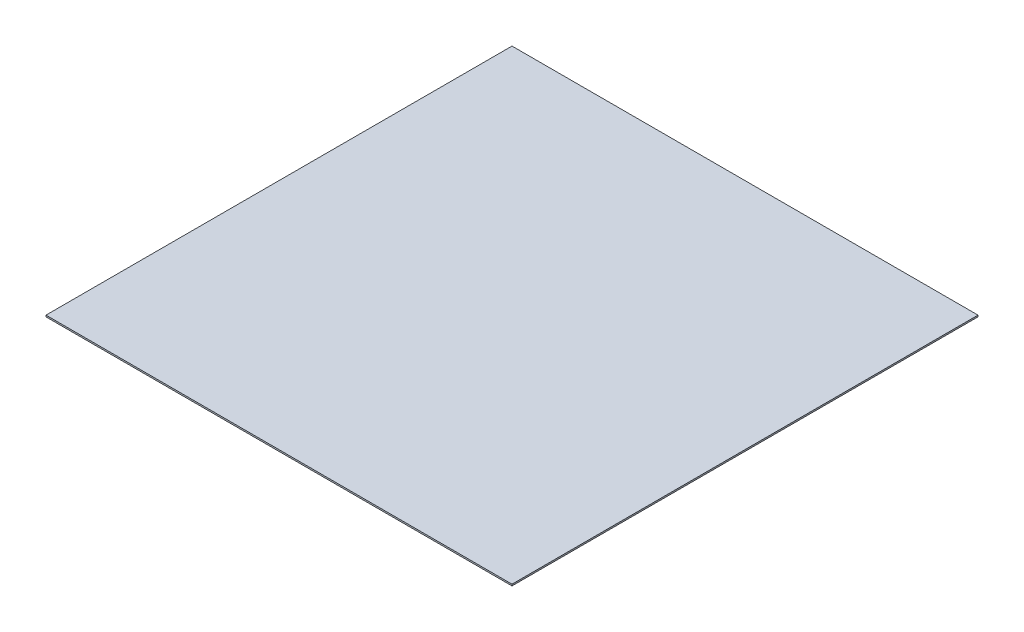
ISO-10303-21;
HEADER;
FILE_DESCRIPTION(('STEP AP214'),'2;1');
FILE_NAME('part.step','',(''),(''),'','','');
FILE_SCHEMA(('AUTOMOTIVE_DESIGN { 1 0 10303 214 1 1 1 1 }'));
ENDSEC;
DATA;
#1=APPLICATION_CONTEXT('core data for automotive mechanical design processes');
#2=APPLICATION_PROTOCOL_DEFINITION('international standard','automotive_design',2000,#1);
#3=PRODUCT_CONTEXT('',#1,'mechanical');
#4=PRODUCT('Part','Part','',(#3));
#5=PRODUCT_RELATED_PRODUCT_CATEGORY('part','',(#4));
#6=PRODUCT_DEFINITION_FORMATION('','',#4);
#7=PRODUCT_DEFINITION_CONTEXT('part definition',#1,'design');
#8=PRODUCT_DEFINITION('design','',#6,#7);
#9=PRODUCT_DEFINITION_SHAPE('','',#8);
#10=(LENGTH_UNIT() NAMED_UNIT(*) SI_UNIT(.MILLI.,.METRE.));
#11=(NAMED_UNIT(*) PLANE_ANGLE_UNIT() SI_UNIT($,.RADIAN.));
#12=(NAMED_UNIT(*) SI_UNIT($,.STERADIAN.) SOLID_ANGLE_UNIT());
#13=UNCERTAINTY_MEASURE_WITH_UNIT(LENGTH_MEASURE(1.E-05),#10,'distance_accuracy_value','');
#14=(GEOMETRIC_REPRESENTATION_CONTEXT(3) GLOBAL_UNCERTAINTY_ASSIGNED_CONTEXT((#13)) GLOBAL_UNIT_ASSIGNED_CONTEXT((#10,
#11,#12)) REPRESENTATION_CONTEXT('',''));
#15=CARTESIAN_POINT('',(0.,0.,0.));
#16=DIRECTION('',(0.,0.,1.));
#17=DIRECTION('',(1.,0.,0.));
#18=AXIS2_PLACEMENT_3D('',#15,#16,#17);
#19=CARTESIAN_POINT('',(0.,10.,0.));
#20=DIRECTION('',(1.,0.,0.));
#21=DIRECTION('',(0.,0.,-1.));
#22=AXIS2_PLACEMENT_3D('',#19,#20,#21);
#23=PLANE('',#22);
#24=DIRECTION('',(0.,0.,1.));
#25=VECTOR('',#24,1.);
#26=CARTESIAN_POINT('',(0.,0.,0.));
#27=LINE('',#26,#25);
#28=CARTESIAN_POINT('',(0.,0.,-3000.));
#29=VERTEX_POINT('',#28);
#30=CARTESIAN_POINT('',(0.,0.,0.));
#31=VERTEX_POINT('',#30);
#32=EDGE_CURVE('E98',#29,#31,#27,.T.);
#33=ORIENTED_EDGE('',*,*,#32,.T.);
#34=DIRECTION('',(0.,-1.,0.));
#35=VECTOR('',#34,1.);
#36=CARTESIAN_POINT('',(0.,10.,0.));
#37=LINE('',#36,#35);
#38=CARTESIAN_POINT('',(0.,10.,0.));
#39=VERTEX_POINT('',#38);
#40=EDGE_CURVE('E11',#39,#31,#37,.T.);
#41=ORIENTED_EDGE('',*,*,#40,.F.);
#42=DIRECTION('',(0.,0.,1.));
#43=VECTOR('',#42,1.);
#44=CARTESIAN_POINT('',(0.,10.,0.));
#45=LINE('',#44,#43);
#46=CARTESIAN_POINT('',(0.,10.,-3000.));
#47=VERTEX_POINT('',#46);
#48=EDGE_CURVE('E86',#47,#39,#45,.T.);
#49=ORIENTED_EDGE('',*,*,#48,.F.);
#50=DIRECTION('',(0.,-1.,0.));
#51=VECTOR('',#50,1.);
#52=CARTESIAN_POINT('',(0.,10.,-3000.));
#53=LINE('',#52,#51);
#54=EDGE_CURVE('E94',#47,#29,#53,.T.);
#55=ORIENTED_EDGE('',*,*,#54,.T.);
#56=EDGE_LOOP('',(#33,#41,#49,#55));
#57=FACE_BOUND('',#56,.T.);
#58=ADVANCED_FACE('F35',(#57),#23,.F.);
#59=CARTESIAN_POINT('',(0.,10.,0.));
#60=DIRECTION('',(0.,0.,-1.));
#61=DIRECTION('',(-1.,0.,0.));
#62=AXIS2_PLACEMENT_3D('',#59,#60,#61);
#63=PLANE('',#62);
#64=DIRECTION('',(1.,0.,0.));
#65=VECTOR('',#64,1.);
#66=CARTESIAN_POINT('',(0.,0.,0.));
#67=LINE('',#66,#65);
#68=CARTESIAN_POINT('',(3000.,0.,0.));
#69=VERTEX_POINT('',#68);
#70=EDGE_CURVE('E90',#31,#69,#67,.T.);
#71=ORIENTED_EDGE('',*,*,#70,.T.);
#72=DIRECTION('',(0.,-1.,0.));
#73=VECTOR('',#72,1.);
#74=CARTESIAN_POINT('',(3000.,10.,0.));
#75=LINE('',#74,#73);
#76=CARTESIAN_POINT('',(3000.,10.,0.));
#77=VERTEX_POINT('',#76);
#78=EDGE_CURVE('E43',#77,#69,#75,.T.);
#79=ORIENTED_EDGE('',*,*,#78,.F.);
#80=DIRECTION('',(1.,0.,0.));
#81=VECTOR('',#80,1.);
#82=CARTESIAN_POINT('',(0.,10.,0.));
#83=LINE('',#82,#81);
#84=EDGE_CURVE('E81',#39,#77,#83,.T.);
#85=ORIENTED_EDGE('',*,*,#84,.F.);
#86=ORIENTED_EDGE('',*,*,#40,.T.);
#87=EDGE_LOOP('',(#71,#79,#85,#86));
#88=FACE_BOUND('',#87,.T.);
#89=ADVANCED_FACE('F89',(#88),#63,.F.);
#90=CARTESIAN_POINT('',(3000.,10.,0.));
#91=DIRECTION('',(-1.,0.,0.));
#92=DIRECTION('',(0.,0.,1.));
#93=AXIS2_PLACEMENT_3D('',#90,#91,#92);
#94=PLANE('',#93);
#95=DIRECTION('',(0.,0.,-1.));
#96=VECTOR('',#95,1.);
#97=CARTESIAN_POINT('',(3000.,0.,0.));
#98=LINE('',#97,#96);
#99=CARTESIAN_POINT('',(3000.,0.,-3000.));
#100=VERTEX_POINT('',#99);
#101=EDGE_CURVE('E68',#69,#100,#98,.T.);
#102=ORIENTED_EDGE('',*,*,#101,.T.);
#103=DIRECTION('',(0.,-1.,0.));
#104=VECTOR('',#103,1.);
#105=CARTESIAN_POINT('',(3000.,10.,-3000.));
#106=LINE('',#105,#104);
#107=CARTESIAN_POINT('',(3000.,10.,-3000.));
#108=VERTEX_POINT('',#107);
#109=EDGE_CURVE('E91',#108,#100,#106,.T.);
#110=ORIENTED_EDGE('',*,*,#109,.F.);
#111=DIRECTION('',(0.,0.,-1.));
#112=VECTOR('',#111,1.);
#113=CARTESIAN_POINT('',(3000.,10.,0.));
#114=LINE('',#113,#112);
#115=EDGE_CURVE('E84',#77,#108,#114,.T.);
#116=ORIENTED_EDGE('',*,*,#115,.F.);
#117=ORIENTED_EDGE('',*,*,#78,.T.);
#118=EDGE_LOOP('',(#102,#110,#116,#117));
#119=FACE_BOUND('',#118,.T.);
#120=ADVANCED_FACE('F92',(#119),#94,.F.);
#121=CARTESIAN_POINT('',(0.,10.,-3000.));
#122=DIRECTION('',(0.,0.,1.));
#123=DIRECTION('',(1.,0.,0.));
#124=AXIS2_PLACEMENT_3D('',#121,#122,#123);
#125=PLANE('',#124);
#126=DIRECTION('',(-1.,0.,0.));
#127=VECTOR('',#126,1.);
#128=CARTESIAN_POINT('',(0.,0.,-3000.));
#129=LINE('',#128,#127);
#130=EDGE_CURVE('E74',#100,#29,#129,.T.);
#131=ORIENTED_EDGE('',*,*,#130,.T.);
#132=ORIENTED_EDGE('',*,*,#54,.F.);
#133=DIRECTION('',(-1.,0.,0.));
#134=VECTOR('',#133,1.);
#135=CARTESIAN_POINT('',(0.,10.,-3000.));
#136=LINE('',#135,#134);
#137=EDGE_CURVE('E51',#108,#47,#136,.T.);
#138=ORIENTED_EDGE('',*,*,#137,.F.);
#139=ORIENTED_EDGE('',*,*,#109,.T.);
#140=EDGE_LOOP('',(#131,#132,#138,#139));
#141=FACE_BOUND('',#140,.T.);
#142=ADVANCED_FACE('F105',(#141),#125,.F.);
#143=CARTESIAN_POINT('',(0.,10.,0.));
#144=DIRECTION('',(0.,-1.,0.));
#145=DIRECTION('',(0.,0.,-1.));
#146=AXIS2_PLACEMENT_3D('',#143,#144,#145);
#147=PLANE('',#146);
#148=ORIENTED_EDGE('',*,*,#48,.T.);
#149=ORIENTED_EDGE('',*,*,#84,.T.);
#150=ORIENTED_EDGE('',*,*,#115,.T.);
#151=ORIENTED_EDGE('',*,*,#137,.T.);
#152=EDGE_LOOP('',(#148,#149,#150,#151));
#153=FACE_BOUND('',#152,.T.);
#154=ADVANCED_FACE('F82',(#153),#147,.F.);
#155=CARTESIAN_POINT('',(0.,0.,0.));
#156=DIRECTION('',(0.,-1.,0.));
#157=DIRECTION('',(0.,0.,-1.));
#158=AXIS2_PLACEMENT_3D('',#155,#156,#157);
#159=PLANE('',#158);
#160=ORIENTED_EDGE('',*,*,#32,.F.);
#161=ORIENTED_EDGE('',*,*,#130,.F.);
#162=ORIENTED_EDGE('',*,*,#101,.F.);
#163=ORIENTED_EDGE('',*,*,#70,.F.);
#164=EDGE_LOOP('',(#160,#161,#162,#163));
#165=FACE_BOUND('',#164,.T.);
#166=ADVANCED_FACE('F108',(#165),#159,.T.);
#167=CLOSED_SHELL('',(#58,#89,#120,#142,#154,#166));
#168=MANIFOLD_SOLID_BREP('B2',#167);
#169=ADVANCED_BREP_SHAPE_REPRESENTATION('',(#18,#168),#14);
#170=SHAPE_DEFINITION_REPRESENTATION(#9,#169);
ENDSEC;
END-ISO-10303-21;
